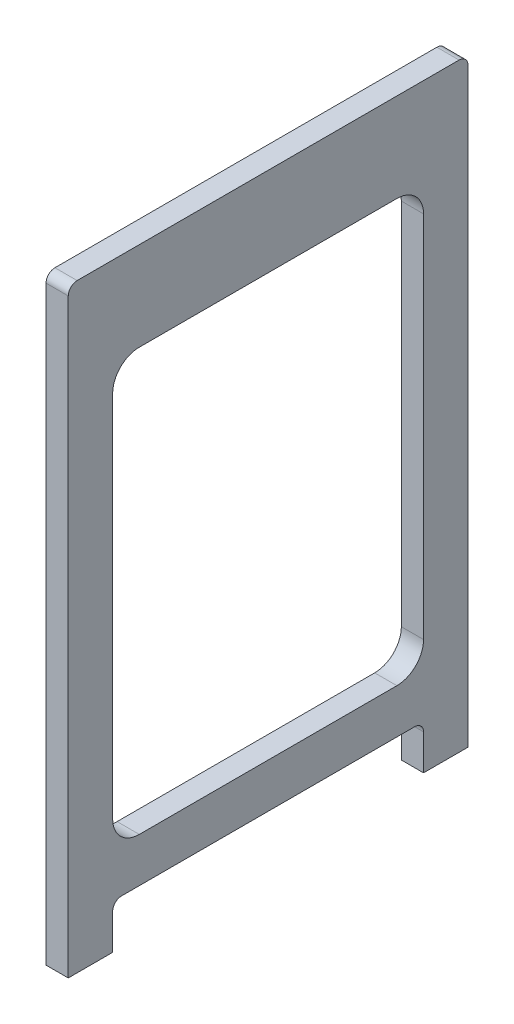
ISO-10303-21;
HEADER;
FILE_DESCRIPTION(('STEP AP214'),'2;1');
FILE_NAME('part.step','',(''),(''),'','','');
FILE_SCHEMA(('AUTOMOTIVE_DESIGN { 1 0 10303 214 1 1 1 1 }'));
ENDSEC;
DATA;
#1=APPLICATION_CONTEXT('core data for automotive mechanical design processes');
#2=APPLICATION_PROTOCOL_DEFINITION('international standard','automotive_design',2000,#1);
#3=PRODUCT_CONTEXT('',#1,'mechanical');
#4=PRODUCT('Part','Part','',(#3));
#5=PRODUCT_RELATED_PRODUCT_CATEGORY('part','',(#4));
#6=PRODUCT_DEFINITION_FORMATION('','',#4);
#7=PRODUCT_DEFINITION_CONTEXT('part definition',#1,'design');
#8=PRODUCT_DEFINITION('design','',#6,#7);
#9=PRODUCT_DEFINITION_SHAPE('','',#8);
#10=(LENGTH_UNIT() NAMED_UNIT(*) SI_UNIT(.MILLI.,.METRE.));
#11=(NAMED_UNIT(*) PLANE_ANGLE_UNIT() SI_UNIT($,.RADIAN.));
#12=(NAMED_UNIT(*) SI_UNIT($,.STERADIAN.) SOLID_ANGLE_UNIT());
#13=UNCERTAINTY_MEASURE_WITH_UNIT(LENGTH_MEASURE(1.E-05),#10,'distance_accuracy_value','');
#14=(GEOMETRIC_REPRESENTATION_CONTEXT(3) GLOBAL_UNCERTAINTY_ASSIGNED_CONTEXT((#13)) GLOBAL_UNIT_ASSIGNED_CONTEXT((#10,
#11,#12)) REPRESENTATION_CONTEXT('',''));
#15=CARTESIAN_POINT('',(0.,0.,0.));
#16=DIRECTION('',(0.,0.,1.));
#17=DIRECTION('',(1.,0.,0.));
#18=AXIS2_PLACEMENT_3D('',#15,#16,#17);
#19=CARTESIAN_POINT('',(12.5,330.,-110.));
#20=DIRECTION('',(-1.,0.,0.));
#21=DIRECTION('',(0.,0.,1.));
#22=AXIS2_PLACEMENT_3D('',#19,#20,#21);
#23=CYLINDRICAL_SURFACE('',#22,2.5);
#24=CARTESIAN_POINT('',(-12.5,330.,-110.));
#25=DIRECTION('',(1.,0.,0.));
#26=DIRECTION('',(0.,0.,1.));
#27=AXIS2_PLACEMENT_3D('',#24,#25,#26);
#28=CIRCLE('',#27,2.5);
#29=CARTESIAN_POINT('',(-12.5,330.,-107.5));
#30=VERTEX_POINT('',#29);
#31=EDGE_CURVE('E356',#30,#30,#28,.T.);
#32=ORIENTED_EDGE('',*,*,#31,.F.);
#33=EDGE_LOOP('',(#32));
#34=FACE_BOUND('',#33,.T.);
#35=CARTESIAN_POINT('',(-2.5,330.,-110.));
#36=DIRECTION('',(1.,0.,0.));
#37=DIRECTION('',(0.,0.,-1.));
#38=AXIS2_PLACEMENT_3D('',#35,#36,#37);
#39=CIRCLE('',#38,2.5);
#40=CARTESIAN_POINT('',(-2.5,330.,-112.5));
#41=VERTEX_POINT('',#40);
#42=EDGE_CURVE('E380',#41,#41,#39,.T.);
#43=ORIENTED_EDGE('',*,*,#42,.T.);
#44=EDGE_LOOP('',(#43));
#45=FACE_BOUND('',#44,.T.);
#46=ADVANCED_FACE('F34',(#34,#45),#23,.F.);
#47=CARTESIAN_POINT('',(12.5,315.,-130.));
#48=DIRECTION('',(-1.,0.,0.));
#49=DIRECTION('',(0.,0.,1.));
#50=AXIS2_PLACEMENT_3D('',#47,#48,#49);
#51=CYLINDRICAL_SURFACE('',#50,2.5);
#52=CARTESIAN_POINT('',(-12.5,315.,-130.));
#53=DIRECTION('',(1.,0.,0.));
#54=DIRECTION('',(0.,0.,1.));
#55=AXIS2_PLACEMENT_3D('',#52,#53,#54);
#56=CIRCLE('',#55,2.5);
#57=CARTESIAN_POINT('',(-12.5,315.,-127.5));
#58=VERTEX_POINT('',#57);
#59=EDGE_CURVE('E362',#58,#58,#56,.T.);
#60=ORIENTED_EDGE('',*,*,#59,.F.);
#61=EDGE_LOOP('',(#60));
#62=FACE_BOUND('',#61,.T.);
#63=CARTESIAN_POINT('',(-2.5,315.,-130.));
#64=DIRECTION('',(1.,0.,0.));
#65=DIRECTION('',(0.,0.,-1.));
#66=AXIS2_PLACEMENT_3D('',#63,#64,#65);
#67=CIRCLE('',#66,2.5);
#68=CARTESIAN_POINT('',(-2.5,315.,-132.5));
#69=VERTEX_POINT('',#68);
#70=EDGE_CURVE('E377',#69,#69,#67,.T.);
#71=ORIENTED_EDGE('',*,*,#70,.T.);
#72=EDGE_LOOP('',(#71));
#73=FACE_BOUND('',#72,.T.);
#74=ADVANCED_FACE('F401',(#62,#73),#51,.F.);
#75=CARTESIAN_POINT('',(12.5,330.,-150.));
#76=DIRECTION('',(-1.,0.,0.));
#77=DIRECTION('',(0.,0.,1.));
#78=AXIS2_PLACEMENT_3D('',#75,#76,#77);
#79=CYLINDRICAL_SURFACE('',#78,2.5);
#80=CARTESIAN_POINT('',(-12.5,330.,-150.));
#81=DIRECTION('',(1.,0.,0.));
#82=DIRECTION('',(0.,0.,1.));
#83=AXIS2_PLACEMENT_3D('',#80,#81,#82);
#84=CIRCLE('',#83,2.5);
#85=CARTESIAN_POINT('',(-12.5,330.,-147.5));
#86=VERTEX_POINT('',#85);
#87=EDGE_CURVE('E359',#86,#86,#84,.T.);
#88=ORIENTED_EDGE('',*,*,#87,.F.);
#89=EDGE_LOOP('',(#88));
#90=FACE_BOUND('',#89,.T.);
#91=CARTESIAN_POINT('',(-2.5,330.,-150.));
#92=DIRECTION('',(1.,0.,0.));
#93=DIRECTION('',(0.,0.,-1.));
#94=AXIS2_PLACEMENT_3D('',#91,#92,#93);
#95=CIRCLE('',#94,2.5);
#96=CARTESIAN_POINT('',(-2.5,330.,-152.5));
#97=VERTEX_POINT('',#96);
#98=EDGE_CURVE('E374',#97,#97,#95,.T.);
#99=ORIENTED_EDGE('',*,*,#98,.T.);
#100=EDGE_LOOP('',(#99));
#101=FACE_BOUND('',#100,.T.);
#102=ADVANCED_FACE('F407',(#90,#101),#79,.F.);
#103=CARTESIAN_POINT('',(12.5,330.,150.));
#104=DIRECTION('',(-1.,0.,0.));
#105=DIRECTION('',(0.,0.,1.));
#106=AXIS2_PLACEMENT_3D('',#103,#104,#105);
#107=CYLINDRICAL_SURFACE('',#106,2.5);
#108=CARTESIAN_POINT('',(-12.5,330.,150.));
#109=DIRECTION('',(1.,0.,0.));
#110=DIRECTION('',(0.,0.,-1.));
#111=AXIS2_PLACEMENT_3D('',#108,#109,#110);
#112=CIRCLE('',#111,2.5);
#113=CARTESIAN_POINT('',(-12.5,330.,147.5));
#114=VERTEX_POINT('',#113);
#115=EDGE_CURVE('E337',#114,#114,#112,.T.);
#116=ORIENTED_EDGE('',*,*,#115,.F.);
#117=EDGE_LOOP('',(#116));
#118=FACE_BOUND('',#117,.T.);
#119=CARTESIAN_POINT('',(-2.5,330.,150.));
#120=DIRECTION('',(1.,0.,0.));
#121=DIRECTION('',(0.,0.,-1.));
#122=AXIS2_PLACEMENT_3D('',#119,#120,#121);
#123=CIRCLE('',#122,2.5);
#124=CARTESIAN_POINT('',(-2.5,330.,147.5));
#125=VERTEX_POINT('',#124);
#126=EDGE_CURVE('E371',#125,#125,#123,.T.);
#127=ORIENTED_EDGE('',*,*,#126,.T.);
#128=EDGE_LOOP('',(#127));
#129=FACE_BOUND('',#128,.T.);
#130=ADVANCED_FACE('F417',(#118,#129),#107,.F.);
#131=CARTESIAN_POINT('',(12.5,315.,130.));
#132=DIRECTION('',(-1.,0.,0.));
#133=DIRECTION('',(0.,0.,1.));
#134=AXIS2_PLACEMENT_3D('',#131,#132,#133);
#135=CYLINDRICAL_SURFACE('',#134,2.5);
#136=CARTESIAN_POINT('',(-12.5,315.,130.));
#137=DIRECTION('',(1.,0.,0.));
#138=DIRECTION('',(0.,0.,-1.));
#139=AXIS2_PLACEMENT_3D('',#136,#137,#138);
#140=CIRCLE('',#139,2.5);
#141=CARTESIAN_POINT('',(-12.5,315.,127.5));
#142=VERTEX_POINT('',#141);
#143=EDGE_CURVE('E353',#142,#142,#140,.T.);
#144=ORIENTED_EDGE('',*,*,#143,.F.);
#145=EDGE_LOOP('',(#144));
#146=FACE_BOUND('',#145,.T.);
#147=CARTESIAN_POINT('',(-2.5,315.,130.));
#148=DIRECTION('',(1.,0.,0.));
#149=DIRECTION('',(0.,0.,-1.));
#150=AXIS2_PLACEMENT_3D('',#147,#148,#149);
#151=CIRCLE('',#150,2.5);
#152=CARTESIAN_POINT('',(-2.5,315.,127.5));
#153=VERTEX_POINT('',#152);
#154=EDGE_CURVE('E368',#153,#153,#151,.T.);
#155=ORIENTED_EDGE('',*,*,#154,.T.);
#156=EDGE_LOOP('',(#155));
#157=FACE_BOUND('',#156,.T.);
#158=ADVANCED_FACE('F413',(#146,#157),#135,.F.);
#159=CARTESIAN_POINT('',(12.5,330.,110.));
#160=DIRECTION('',(-1.,0.,0.));
#161=DIRECTION('',(0.,0.,1.));
#162=AXIS2_PLACEMENT_3D('',#159,#160,#161);
#163=CYLINDRICAL_SURFACE('',#162,2.5);
#164=CARTESIAN_POINT('',(-12.5,330.,110.));
#165=DIRECTION('',(1.,0.,0.));
#166=DIRECTION('',(0.,0.,-1.));
#167=AXIS2_PLACEMENT_3D('',#164,#165,#166);
#168=CIRCLE('',#167,2.5);
#169=CARTESIAN_POINT('',(-12.5,330.,107.5));
#170=VERTEX_POINT('',#169);
#171=EDGE_CURVE('E350',#170,#170,#168,.T.);
#172=ORIENTED_EDGE('',*,*,#171,.F.);
#173=EDGE_LOOP('',(#172));
#174=FACE_BOUND('',#173,.T.);
#175=CARTESIAN_POINT('',(-2.5,330.,110.));
#176=DIRECTION('',(1.,0.,0.));
#177=DIRECTION('',(0.,0.,-1.));
#178=AXIS2_PLACEMENT_3D('',#175,#176,#177);
#179=CIRCLE('',#178,2.5);
#180=CARTESIAN_POINT('',(-2.5,330.,107.5));
#181=VERTEX_POINT('',#180);
#182=EDGE_CURVE('E365',#181,#181,#179,.T.);
#183=ORIENTED_EDGE('',*,*,#182,.T.);
#184=EDGE_LOOP('',(#183));
#185=FACE_BOUND('',#184,.T.);
#186=ADVANCED_FACE('F416',(#174,#185),#163,.F.);
#187=CARTESIAN_POINT('',(12.5,0.,0.));
#188=DIRECTION('',(1.,0.,0.));
#189=DIRECTION('',(0.,0.,-1.));
#190=AXIS2_PLACEMENT_3D('',#187,#188,#189);
#191=PLANE('',#190);
#192=DIRECTION('',(0.,1.,0.));
#193=VECTOR('',#192,1.);
#194=CARTESIAN_POINT('',(12.5,-337.5,-225.));
#195=LINE('',#194,#193);
#196=CARTESIAN_POINT('',(12.5,-337.5,-225.));
#197=VERTEX_POINT('',#196);
#198=CARTESIAN_POINT('',(12.5,327.5,-225.));
#199=VERTEX_POINT('',#198);
#200=EDGE_CURVE('E268',#197,#199,#195,.T.);
#201=ORIENTED_EDGE('',*,*,#200,.T.);
#202=CARTESIAN_POINT('',(12.5,327.5,-215.));
#203=DIRECTION('',(1.,0.,0.));
#204=DIRECTION('',(0.,0.,-1.));
#205=AXIS2_PLACEMENT_3D('',#202,#203,#204);
#206=CIRCLE('',#205,10.);
#207=CARTESIAN_POINT('',(12.5,337.5,-215.));
#208=VERTEX_POINT('',#207);
#209=EDGE_CURVE('E42',#199,#208,#206,.T.);
#210=ORIENTED_EDGE('',*,*,#209,.T.);
#211=DIRECTION('',(0.,0.,1.));
#212=VECTOR('',#211,1.);
#213=CARTESIAN_POINT('',(12.5,337.5,-225.));
#214=LINE('',#213,#212);
#215=CARTESIAN_POINT('',(12.5,337.5,215.));
#216=VERTEX_POINT('',#215);
#217=EDGE_CURVE('E267',#208,#216,#214,.T.);
#218=ORIENTED_EDGE('',*,*,#217,.T.);
#219=CARTESIAN_POINT('',(12.5,327.5,215.));
#220=DIRECTION('',(1.,0.,0.));
#221=DIRECTION('',(0.,0.,-1.));
#222=AXIS2_PLACEMENT_3D('',#219,#220,#221);
#223=CIRCLE('',#222,10.);
#224=CARTESIAN_POINT('',(12.5,327.5,225.));
#225=VERTEX_POINT('',#224);
#226=EDGE_CURVE('E49',#216,#225,#223,.T.);
#227=ORIENTED_EDGE('',*,*,#226,.T.);
#228=DIRECTION('',(0.,-1.,0.));
#229=VECTOR('',#228,1.);
#230=CARTESIAN_POINT('',(12.5,-337.5,225.));
#231=LINE('',#230,#229);
#232=CARTESIAN_POINT('',(12.5,-337.5,225.));
#233=VERTEX_POINT('',#232);
#234=EDGE_CURVE('E171',#225,#233,#231,.T.);
#235=ORIENTED_EDGE('',*,*,#234,.T.);
#236=DIRECTION('',(0.,0.,-1.));
#237=VECTOR('',#236,1.);
#238=CARTESIAN_POINT('',(12.5,-337.5,175.));
#239=LINE('',#238,#237);
#240=CARTESIAN_POINT('',(12.5,-337.5,175.));
#241=VERTEX_POINT('',#240);
#242=EDGE_CURVE('E176',#233,#241,#239,.T.);
#243=ORIENTED_EDGE('',*,*,#242,.T.);
#244=DIRECTION('',(0.,1.,0.));
#245=VECTOR('',#244,1.);
#246=CARTESIAN_POINT('',(12.5,-337.5,175.));
#247=LINE('',#246,#245);
#248=CARTESIAN_POINT('',(12.5,-297.5,175.));
#249=VERTEX_POINT('',#248);
#250=EDGE_CURVE('E190',#241,#249,#247,.T.);
#251=ORIENTED_EDGE('',*,*,#250,.T.);
#252=CARTESIAN_POINT('',(12.5,-297.5,165.));
#253=DIRECTION('',(1.,0.,0.));
#254=DIRECTION('',(0.,0.,-1.));
#255=AXIS2_PLACEMENT_3D('',#252,#253,#254);
#256=CIRCLE('',#255,10.);
#257=CARTESIAN_POINT('',(12.5,-287.5,165.));
#258=VERTEX_POINT('',#257);
#259=EDGE_CURVE('E217',#249,#258,#256,.F.);
#260=ORIENTED_EDGE('',*,*,#259,.T.);
#261=DIRECTION('',(0.,0.,-1.));
#262=VECTOR('',#261,1.);
#263=CARTESIAN_POINT('',(12.5,-287.5,175.));
#264=LINE('',#263,#262);
#265=CARTESIAN_POINT('',(12.5,-287.5,-165.));
#266=VERTEX_POINT('',#265);
#267=EDGE_CURVE('E320',#258,#266,#264,.T.);
#268=ORIENTED_EDGE('',*,*,#267,.T.);
#269=CARTESIAN_POINT('',(12.5,-297.5,-165.));
#270=DIRECTION('',(1.,0.,0.));
#271=DIRECTION('',(0.,0.,-1.));
#272=AXIS2_PLACEMENT_3D('',#269,#270,#271);
#273=CIRCLE('',#272,10.);
#274=CARTESIAN_POINT('',(12.5,-297.5,-175.));
#275=VERTEX_POINT('',#274);
#276=EDGE_CURVE('E213',#266,#275,#273,.F.);
#277=ORIENTED_EDGE('',*,*,#276,.T.);
#278=DIRECTION('',(0.,-1.,0.));
#279=VECTOR('',#278,1.);
#280=CARTESIAN_POINT('',(12.5,-337.5,-175.));
#281=LINE('',#280,#279);
#282=CARTESIAN_POINT('',(12.5,-337.5,-175.));
#283=VERTEX_POINT('',#282);
#284=EDGE_CURVE('E318',#275,#283,#281,.T.);
#285=ORIENTED_EDGE('',*,*,#284,.T.);
#286=DIRECTION('',(0.,0.,-1.));
#287=VECTOR('',#286,1.);
#288=CARTESIAN_POINT('',(12.5,-337.5,-225.));
#289=LINE('',#288,#287);
#290=EDGE_CURVE('E300',#283,#197,#289,.T.);
#291=ORIENTED_EDGE('',*,*,#290,.T.);
#292=EDGE_LOOP('',(#201,#210,#218,#227,#235,#243,#251,#260,#268,#277,#285,#291));
#293=FACE_BOUND('',#292,.T.);
#294=DIRECTION('',(0.,0.,-1.));
#295=VECTOR('',#294,1.);
#296=CARTESIAN_POINT('',(12.5,-237.5,-175.));
#297=LINE('',#296,#295);
#298=CARTESIAN_POINT('',(12.5,-237.5,145.));
#299=VERTEX_POINT('',#298);
#300=CARTESIAN_POINT('',(12.5,-237.5,-145.));
#301=VERTEX_POINT('',#300);
#302=EDGE_CURVE('E343',#299,#301,#297,.T.);
#303=ORIENTED_EDGE('',*,*,#302,.F.);
#304=CARTESIAN_POINT('',(12.5,-207.5,145.));
#305=DIRECTION('',(1.,0.,0.));
#306=DIRECTION('',(0.,0.,-1.));
#307=AXIS2_PLACEMENT_3D('',#304,#305,#306);
#308=CIRCLE('',#307,30.);
#309=CARTESIAN_POINT('',(12.5,-207.5,175.));
#310=VERTEX_POINT('',#309);
#311=EDGE_CURVE('E253',#299,#310,#308,.F.);
#312=ORIENTED_EDGE('',*,*,#311,.T.);
#313=DIRECTION('',(0.,-1.,0.));
#314=VECTOR('',#313,1.);
#315=CARTESIAN_POINT('',(12.5,-237.5,175.));
#316=LINE('',#315,#314);
#317=CARTESIAN_POINT('',(12.5,207.5,175.));
#318=VERTEX_POINT('',#317);
#319=EDGE_CURVE('E327',#318,#310,#316,.T.);
#320=ORIENTED_EDGE('',*,*,#319,.F.);
#321=CARTESIAN_POINT('',(12.5,207.5,145.));
#322=DIRECTION('',(1.,0.,0.));
#323=DIRECTION('',(0.,0.,-1.));
#324=AXIS2_PLACEMENT_3D('',#321,#322,#323);
#325=CIRCLE('',#324,30.);
#326=CARTESIAN_POINT('',(12.5,237.5,145.));
#327=VERTEX_POINT('',#326);
#328=EDGE_CURVE('E241',#318,#327,#325,.F.);
#329=ORIENTED_EDGE('',*,*,#328,.T.);
#330=DIRECTION('',(0.,0.,1.));
#331=VECTOR('',#330,1.);
#332=CARTESIAN_POINT('',(12.5,237.5,-175.));
#333=LINE('',#332,#331);
#334=CARTESIAN_POINT('',(12.5,237.5,-145.));
#335=VERTEX_POINT('',#334);
#336=EDGE_CURVE('E314',#335,#327,#333,.T.);
#337=ORIENTED_EDGE('',*,*,#336,.F.);
#338=CARTESIAN_POINT('',(12.5,207.5,-145.));
#339=DIRECTION('',(1.,0.,0.));
#340=DIRECTION('',(0.,0.,-1.));
#341=AXIS2_PLACEMENT_3D('',#338,#339,#340);
#342=CIRCLE('',#341,30.);
#343=CARTESIAN_POINT('',(12.5,207.5,-175.));
#344=VERTEX_POINT('',#343);
#345=EDGE_CURVE('E245',#335,#344,#342,.F.);
#346=ORIENTED_EDGE('',*,*,#345,.T.);
#347=DIRECTION('',(0.,1.,0.));
#348=VECTOR('',#347,1.);
#349=CARTESIAN_POINT('',(12.5,-237.5,-175.));
#350=LINE('',#349,#348);
#351=CARTESIAN_POINT('',(12.5,-207.5,-175.));
#352=VERTEX_POINT('',#351);
#353=EDGE_CURVE('E340',#352,#344,#350,.T.);
#354=ORIENTED_EDGE('',*,*,#353,.F.);
#355=CARTESIAN_POINT('',(12.5,-207.5,-145.));
#356=DIRECTION('',(1.,0.,0.));
#357=DIRECTION('',(0.,0.,-1.));
#358=AXIS2_PLACEMENT_3D('',#355,#356,#357);
#359=CIRCLE('',#358,30.);
#360=EDGE_CURVE('E249',#352,#301,#359,.F.);
#361=ORIENTED_EDGE('',*,*,#360,.T.);
#362=EDGE_LOOP('',(#303,#312,#320,#329,#337,#346,#354,#361));
#363=FACE_BOUND('',#362,.T.);
#364=ADVANCED_FACE('F173',(#293,#363),#191,.T.);
#365=CARTESIAN_POINT('',(-12.5,0.,0.));
#366=DIRECTION('',(1.,0.,0.));
#367=DIRECTION('',(0.,0.,-1.));
#368=AXIS2_PLACEMENT_3D('',#365,#366,#367);
#369=PLANE('',#368);
#370=DIRECTION('',(0.,0.,1.));
#371=VECTOR('',#370,1.);
#372=CARTESIAN_POINT('',(-12.5,337.5,-225.));
#373=LINE('',#372,#371);
#374=CARTESIAN_POINT('',(-12.5,337.5,-215.));
#375=VERTEX_POINT('',#374);
#376=CARTESIAN_POINT('',(-12.5,337.5,215.));
#377=VERTEX_POINT('',#376);
#378=EDGE_CURVE('E181',#375,#377,#373,.T.);
#379=ORIENTED_EDGE('',*,*,#378,.F.);
#380=CARTESIAN_POINT('',(-12.5,327.5,-215.));
#381=DIRECTION('',(1.,0.,0.));
#382=DIRECTION('',(0.,0.,-1.));
#383=AXIS2_PLACEMENT_3D('',#380,#381,#382);
#384=CIRCLE('',#383,10.);
#385=CARTESIAN_POINT('',(-12.5,327.5,-225.));
#386=VERTEX_POINT('',#385);
#387=EDGE_CURVE('E262',#375,#386,#384,.F.);
#388=ORIENTED_EDGE('',*,*,#387,.T.);
#389=DIRECTION('',(0.,1.,0.));
#390=VECTOR('',#389,1.);
#391=CARTESIAN_POINT('',(-12.5,-337.5,-225.));
#392=LINE('',#391,#390);
#393=CARTESIAN_POINT('',(-12.5,-337.5,-225.));
#394=VERTEX_POINT('',#393);
#395=EDGE_CURVE('E284',#394,#386,#392,.T.);
#396=ORIENTED_EDGE('',*,*,#395,.F.);
#397=DIRECTION('',(0.,0.,-1.));
#398=VECTOR('',#397,1.);
#399=CARTESIAN_POINT('',(-12.5,-337.5,-225.));
#400=LINE('',#399,#398);
#401=CARTESIAN_POINT('',(-12.5,-337.5,-175.));
#402=VERTEX_POINT('',#401);
#403=EDGE_CURVE('E288',#402,#394,#400,.T.);
#404=ORIENTED_EDGE('',*,*,#403,.F.);
#405=DIRECTION('',(0.,-1.,0.));
#406=VECTOR('',#405,1.);
#407=CARTESIAN_POINT('',(-12.5,-337.5,-175.));
#408=LINE('',#407,#406);
#409=CARTESIAN_POINT('',(-12.5,-297.5,-175.));
#410=VERTEX_POINT('',#409);
#411=EDGE_CURVE('E291',#410,#402,#408,.T.);
#412=ORIENTED_EDGE('',*,*,#411,.F.);
#413=CARTESIAN_POINT('',(-12.5,-297.5,-165.));
#414=DIRECTION('',(1.,0.,0.));
#415=DIRECTION('',(0.,0.,-1.));
#416=AXIS2_PLACEMENT_3D('',#413,#414,#415);
#417=CIRCLE('',#416,10.);
#418=CARTESIAN_POINT('',(-12.5,-287.5,-165.));
#419=VERTEX_POINT('',#418);
#420=EDGE_CURVE('E211',#410,#419,#417,.T.);
#421=ORIENTED_EDGE('',*,*,#420,.T.);
#422=DIRECTION('',(0.,0.,-1.));
#423=VECTOR('',#422,1.);
#424=CARTESIAN_POINT('',(-12.5,-287.5,175.));
#425=LINE('',#424,#423);
#426=CARTESIAN_POINT('',(-12.5,-287.5,165.));
#427=VERTEX_POINT('',#426);
#428=EDGE_CURVE('E306',#427,#419,#425,.T.);
#429=ORIENTED_EDGE('',*,*,#428,.F.);
#430=CARTESIAN_POINT('',(-12.5,-297.5,165.));
#431=DIRECTION('',(1.,0.,0.));
#432=DIRECTION('',(0.,0.,-1.));
#433=AXIS2_PLACEMENT_3D('',#430,#431,#432);
#434=CIRCLE('',#433,10.);
#435=CARTESIAN_POINT('',(-12.5,-297.5,175.));
#436=VERTEX_POINT('',#435);
#437=EDGE_CURVE('E215',#427,#436,#434,.T.);
#438=ORIENTED_EDGE('',*,*,#437,.T.);
#439=DIRECTION('',(0.,1.,0.));
#440=VECTOR('',#439,1.);
#441=CARTESIAN_POINT('',(-12.5,-337.5,175.));
#442=LINE('',#441,#440);
#443=CARTESIAN_POINT('',(-12.5,-337.5,175.));
#444=VERTEX_POINT('',#443);
#445=EDGE_CURVE('E307',#444,#436,#442,.T.);
#446=ORIENTED_EDGE('',*,*,#445,.F.);
#447=DIRECTION('',(0.,0.,-1.));
#448=VECTOR('',#447,1.);
#449=CARTESIAN_POINT('',(-12.5,-337.5,175.));
#450=LINE('',#449,#448);
#451=CARTESIAN_POINT('',(-12.5,-337.5,225.));
#452=VERTEX_POINT('',#451);
#453=EDGE_CURVE('E312',#452,#444,#450,.T.);
#454=ORIENTED_EDGE('',*,*,#453,.F.);
#455=DIRECTION('',(0.,-1.,0.));
#456=VECTOR('',#455,1.);
#457=CARTESIAN_POINT('',(-12.5,-337.5,225.));
#458=LINE('',#457,#456);
#459=CARTESIAN_POINT('',(-12.5,327.5,225.));
#460=VERTEX_POINT('',#459);
#461=EDGE_CURVE('E194',#460,#452,#458,.T.);
#462=ORIENTED_EDGE('',*,*,#461,.F.);
#463=CARTESIAN_POINT('',(-12.5,327.5,215.));
#464=DIRECTION('',(1.,0.,0.));
#465=DIRECTION('',(0.,0.,-1.));
#466=AXIS2_PLACEMENT_3D('',#463,#464,#465);
#467=CIRCLE('',#466,10.);
#468=EDGE_CURVE('E260',#460,#377,#467,.F.);
#469=ORIENTED_EDGE('',*,*,#468,.T.);
#470=EDGE_LOOP('',(#379,#388,#396,#404,#412,#421,#429,#438,#446,#454,#462,#469));
#471=FACE_BOUND('',#470,.T.);
#472=DIRECTION('',(0.,0.,1.));
#473=VECTOR('',#472,1.);
#474=CARTESIAN_POINT('',(-12.5,237.5,-175.));
#475=LINE('',#474,#473);
#476=CARTESIAN_POINT('',(-12.5,237.5,-145.));
#477=VERTEX_POINT('',#476);
#478=CARTESIAN_POINT('',(-12.5,237.5,145.));
#479=VERTEX_POINT('',#478);
#480=EDGE_CURVE('E324',#477,#479,#475,.T.);
#481=ORIENTED_EDGE('',*,*,#480,.T.);
#482=CARTESIAN_POINT('',(-12.5,207.5,145.));
#483=DIRECTION('',(1.,0.,0.));
#484=DIRECTION('',(0.,0.,-1.));
#485=AXIS2_PLACEMENT_3D('',#482,#483,#484);
#486=CIRCLE('',#485,30.);
#487=CARTESIAN_POINT('',(-12.5,207.5,175.));
#488=VERTEX_POINT('',#487);
#489=EDGE_CURVE('E239',#479,#488,#486,.T.);
#490=ORIENTED_EDGE('',*,*,#489,.T.);
#491=DIRECTION('',(0.,-1.,0.));
#492=VECTOR('',#491,1.);
#493=CARTESIAN_POINT('',(-12.5,-237.5,175.));
#494=LINE('',#493,#492);
#495=CARTESIAN_POINT('',(-12.5,-207.5,175.));
#496=VERTEX_POINT('',#495);
#497=EDGE_CURVE('E334',#488,#496,#494,.T.);
#498=ORIENTED_EDGE('',*,*,#497,.T.);
#499=CARTESIAN_POINT('',(-12.5,-207.5,145.));
#500=DIRECTION('',(1.,0.,0.));
#501=DIRECTION('',(0.,0.,-1.));
#502=AXIS2_PLACEMENT_3D('',#499,#500,#501);
#503=CIRCLE('',#502,30.);
#504=CARTESIAN_POINT('',(-12.5,-237.5,145.));
#505=VERTEX_POINT('',#504);
#506=EDGE_CURVE('E251',#496,#505,#503,.T.);
#507=ORIENTED_EDGE('',*,*,#506,.T.);
#508=DIRECTION('',(0.,0.,-1.));
#509=VECTOR('',#508,1.);
#510=CARTESIAN_POINT('',(-12.5,-237.5,-175.));
#511=LINE('',#510,#509);
#512=CARTESIAN_POINT('',(-12.5,-237.5,-145.));
#513=VERTEX_POINT('',#512);
#514=EDGE_CURVE('E331',#505,#513,#511,.T.);
#515=ORIENTED_EDGE('',*,*,#514,.T.);
#516=CARTESIAN_POINT('',(-12.5,-207.5,-145.));
#517=DIRECTION('',(1.,0.,0.));
#518=DIRECTION('',(0.,0.,-1.));
#519=AXIS2_PLACEMENT_3D('',#516,#517,#518);
#520=CIRCLE('',#519,30.);
#521=CARTESIAN_POINT('',(-12.5,-207.5,-175.));
#522=VERTEX_POINT('',#521);
#523=EDGE_CURVE('E247',#513,#522,#520,.T.);
#524=ORIENTED_EDGE('',*,*,#523,.T.);
#525=DIRECTION('',(0.,1.,0.));
#526=VECTOR('',#525,1.);
#527=CARTESIAN_POINT('',(-12.5,-237.5,-175.));
#528=LINE('',#527,#526);
#529=CARTESIAN_POINT('',(-12.5,207.5,-175.));
#530=VERTEX_POINT('',#529);
#531=EDGE_CURVE('E328',#522,#530,#528,.T.);
#532=ORIENTED_EDGE('',*,*,#531,.T.);
#533=CARTESIAN_POINT('',(-12.5,207.5,-145.));
#534=DIRECTION('',(1.,0.,0.));
#535=DIRECTION('',(0.,0.,-1.));
#536=AXIS2_PLACEMENT_3D('',#533,#534,#535);
#537=CIRCLE('',#536,30.);
#538=EDGE_CURVE('E243',#530,#477,#537,.T.);
#539=ORIENTED_EDGE('',*,*,#538,.T.);
#540=EDGE_LOOP('',(#481,#490,#498,#507,#515,#524,#532,#539));
#541=FACE_BOUND('',#540,.T.);
#542=ORIENTED_EDGE('',*,*,#115,.T.);
#543=EDGE_LOOP('',(#542));
#544=FACE_BOUND('',#543,.T.);
#545=ORIENTED_EDGE('',*,*,#171,.T.);
#546=EDGE_LOOP('',(#545));
#547=FACE_BOUND('',#546,.T.);
#548=ORIENTED_EDGE('',*,*,#143,.T.);
#549=EDGE_LOOP('',(#548));
#550=FACE_BOUND('',#549,.T.);
#551=ORIENTED_EDGE('',*,*,#31,.T.);
#552=EDGE_LOOP('',(#551));
#553=FACE_BOUND('',#552,.T.);
#554=ORIENTED_EDGE('',*,*,#87,.T.);
#555=EDGE_LOOP('',(#554));
#556=FACE_BOUND('',#555,.T.);
#557=ORIENTED_EDGE('',*,*,#59,.T.);
#558=EDGE_LOOP('',(#557));
#559=FACE_BOUND('',#558,.T.);
#560=ADVANCED_FACE('F281',(#471,#541,#544,#547,#550,#553,#556,#559),#369,.F.);
#561=CARTESIAN_POINT('',(12.5,-337.5,225.));
#562=DIRECTION('',(0.,0.,-1.));
#563=DIRECTION('',(-1.,0.,0.));
#564=AXIS2_PLACEMENT_3D('',#561,#562,#563);
#565=PLANE('',#564);
#566=ORIENTED_EDGE('',*,*,#234,.F.);
#567=DIRECTION('',(-1.,0.,0.));
#568=VECTOR('',#567,1.);
#569=CARTESIAN_POINT('',(12.5,327.5,225.));
#570=LINE('',#569,#568);
#571=EDGE_CURVE('E11',#225,#460,#570,.T.);
#572=ORIENTED_EDGE('',*,*,#571,.T.);
#573=ORIENTED_EDGE('',*,*,#461,.T.);
#574=DIRECTION('',(-1.,0.,0.));
#575=VECTOR('',#574,1.);
#576=CARTESIAN_POINT('',(12.5,-337.5,225.));
#577=LINE('',#576,#575);
#578=EDGE_CURVE('E186',#233,#452,#577,.T.);
#579=ORIENTED_EDGE('',*,*,#578,.F.);
#580=EDGE_LOOP('',(#566,#572,#573,#579));
#581=FACE_BOUND('',#580,.T.);
#582=ADVANCED_FACE('F192',(#581),#565,.F.);
#583=CARTESIAN_POINT('',(12.5,-337.5,175.));
#584=DIRECTION('',(0.,1.,0.));
#585=DIRECTION('',(0.,0.,1.));
#586=AXIS2_PLACEMENT_3D('',#583,#584,#585);
#587=PLANE('',#586);
#588=ORIENTED_EDGE('',*,*,#453,.T.);
#589=DIRECTION('',(-1.,0.,0.));
#590=VECTOR('',#589,1.);
#591=CARTESIAN_POINT('',(12.5,-337.5,175.));
#592=LINE('',#591,#590);
#593=EDGE_CURVE('E188',#241,#444,#592,.T.);
#594=ORIENTED_EDGE('',*,*,#593,.F.);
#595=ORIENTED_EDGE('',*,*,#242,.F.);
#596=ORIENTED_EDGE('',*,*,#578,.T.);
#597=EDGE_LOOP('',(#588,#594,#595,#596));
#598=FACE_BOUND('',#597,.T.);
#599=ADVANCED_FACE('F185',(#598),#587,.F.);
#600=CARTESIAN_POINT('',(12.5,-337.5,175.));
#601=DIRECTION('',(0.,0.,1.));
#602=DIRECTION('',(1.,0.,0.));
#603=AXIS2_PLACEMENT_3D('',#600,#601,#602);
#604=PLANE('',#603);
#605=ORIENTED_EDGE('',*,*,#445,.T.);
#606=DIRECTION('',(-1.,0.,0.));
#607=VECTOR('',#606,1.);
#608=CARTESIAN_POINT('',(12.5,-297.5,175.));
#609=LINE('',#608,#607);
#610=EDGE_CURVE('E209',#436,#249,#609,.F.);
#611=ORIENTED_EDGE('',*,*,#610,.T.);
#612=ORIENTED_EDGE('',*,*,#250,.F.);
#613=ORIENTED_EDGE('',*,*,#593,.T.);
#614=EDGE_LOOP('',(#605,#611,#612,#613));
#615=FACE_BOUND('',#614,.T.);
#616=ADVANCED_FACE('F458',(#615),#604,.F.);
#617=CARTESIAN_POINT('',(12.5,-287.5,175.));
#618=DIRECTION('',(0.,1.,0.));
#619=DIRECTION('',(0.,0.,1.));
#620=AXIS2_PLACEMENT_3D('',#617,#618,#619);
#621=PLANE('',#620);
#622=ORIENTED_EDGE('',*,*,#428,.T.);
#623=DIRECTION('',(-1.,0.,0.));
#624=VECTOR('',#623,1.);
#625=CARTESIAN_POINT('',(12.5,-287.5,-165.));
#626=LINE('',#625,#624);
#627=EDGE_CURVE('E207',#419,#266,#626,.F.);
#628=ORIENTED_EDGE('',*,*,#627,.T.);
#629=ORIENTED_EDGE('',*,*,#267,.F.);
#630=DIRECTION('',(-1.,0.,0.));
#631=VECTOR('',#630,1.);
#632=CARTESIAN_POINT('',(-12.5,-287.5,165.));
#633=LINE('',#632,#631);
#634=EDGE_CURVE('E199',#258,#427,#633,.T.);
#635=ORIENTED_EDGE('',*,*,#634,.T.);
#636=EDGE_LOOP('',(#622,#628,#629,#635));
#637=FACE_BOUND('',#636,.T.);
#638=ADVANCED_FACE('F455',(#637),#621,.F.);
#639=CARTESIAN_POINT('',(12.5,-337.5,-175.));
#640=DIRECTION('',(0.,0.,-1.));
#641=DIRECTION('',(-1.,0.,0.));
#642=AXIS2_PLACEMENT_3D('',#639,#640,#641);
#643=PLANE('',#642);
#644=ORIENTED_EDGE('',*,*,#284,.F.);
#645=DIRECTION('',(-1.,0.,0.));
#646=VECTOR('',#645,1.);
#647=CARTESIAN_POINT('',(-12.5,-297.5,-175.));
#648=LINE('',#647,#646);
#649=EDGE_CURVE('E196',#275,#410,#648,.T.);
#650=ORIENTED_EDGE('',*,*,#649,.T.);
#651=ORIENTED_EDGE('',*,*,#411,.T.);
#652=DIRECTION('',(-1.,0.,0.));
#653=VECTOR('',#652,1.);
#654=CARTESIAN_POINT('',(12.5,-337.5,-175.));
#655=LINE('',#654,#653);
#656=EDGE_CURVE('E201',#283,#402,#655,.T.);
#657=ORIENTED_EDGE('',*,*,#656,.F.);
#658=EDGE_LOOP('',(#644,#650,#651,#657));
#659=FACE_BOUND('',#658,.T.);
#660=ADVANCED_FACE('F452',(#659),#643,.F.);
#661=CARTESIAN_POINT('',(12.5,-337.5,-225.));
#662=DIRECTION('',(0.,1.,0.));
#663=DIRECTION('',(0.,0.,1.));
#664=AXIS2_PLACEMENT_3D('',#661,#662,#663);
#665=PLANE('',#664);
#666=ORIENTED_EDGE('',*,*,#403,.T.);
#667=DIRECTION('',(-1.,0.,0.));
#668=VECTOR('',#667,1.);
#669=CARTESIAN_POINT('',(12.5,-337.5,-225.));
#670=LINE('',#669,#668);
#671=EDGE_CURVE('E276',#197,#394,#670,.T.);
#672=ORIENTED_EDGE('',*,*,#671,.F.);
#673=ORIENTED_EDGE('',*,*,#290,.F.);
#674=ORIENTED_EDGE('',*,*,#656,.T.);
#675=EDGE_LOOP('',(#666,#672,#673,#674));
#676=FACE_BOUND('',#675,.T.);
#677=ADVANCED_FACE('F299',(#676),#665,.F.);
#678=CARTESIAN_POINT('',(12.5,-337.5,-225.));
#679=DIRECTION('',(0.,0.,1.));
#680=DIRECTION('',(1.,0.,0.));
#681=AXIS2_PLACEMENT_3D('',#678,#679,#680);
#682=PLANE('',#681);
#683=ORIENTED_EDGE('',*,*,#395,.T.);
#684=DIRECTION('',(-1.,0.,0.));
#685=VECTOR('',#684,1.);
#686=CARTESIAN_POINT('',(12.5,327.5,-225.));
#687=LINE('',#686,#685);
#688=EDGE_CURVE('E57',#386,#199,#687,.F.);
#689=ORIENTED_EDGE('',*,*,#688,.T.);
#690=ORIENTED_EDGE('',*,*,#200,.F.);
#691=ORIENTED_EDGE('',*,*,#671,.T.);
#692=EDGE_LOOP('',(#683,#689,#690,#691));
#693=FACE_BOUND('',#692,.T.);
#694=ADVANCED_FACE('F286',(#693),#682,.F.);
#695=CARTESIAN_POINT('',(12.5,337.5,-225.));
#696=DIRECTION('',(0.,-1.,0.));
#697=DIRECTION('',(0.,0.,-1.));
#698=AXIS2_PLACEMENT_3D('',#695,#696,#697);
#699=PLANE('',#698);
#700=ORIENTED_EDGE('',*,*,#217,.F.);
#701=DIRECTION('',(-1.,0.,0.));
#702=VECTOR('',#701,1.);
#703=CARTESIAN_POINT('',(12.5,337.5,-215.));
#704=LINE('',#703,#702);
#705=EDGE_CURVE('E257',#208,#375,#704,.T.);
#706=ORIENTED_EDGE('',*,*,#705,.T.);
#707=ORIENTED_EDGE('',*,*,#378,.T.);
#708=DIRECTION('',(-1.,0.,0.));
#709=VECTOR('',#708,1.);
#710=CARTESIAN_POINT('',(12.5,337.5,215.));
#711=LINE('',#710,#709);
#712=EDGE_CURVE('E255',#377,#216,#711,.F.);
#713=ORIENTED_EDGE('',*,*,#712,.T.);
#714=EDGE_LOOP('',(#700,#706,#707,#713));
#715=FACE_BOUND('',#714,.T.);
#716=ADVANCED_FACE('F272',(#715),#699,.F.);
#717=CARTESIAN_POINT('',(12.5,-237.5,175.));
#718=DIRECTION('',(0.,0.,-1.));
#719=DIRECTION('',(-1.,0.,0.));
#720=AXIS2_PLACEMENT_3D('',#717,#718,#719);
#721=PLANE('',#720);
#722=ORIENTED_EDGE('',*,*,#497,.F.);
#723=DIRECTION('',(-1.,0.,0.));
#724=VECTOR('',#723,1.);
#725=CARTESIAN_POINT('',(12.5,207.5,175.));
#726=LINE('',#725,#724);
#727=EDGE_CURVE('E227',#488,#318,#726,.F.);
#728=ORIENTED_EDGE('',*,*,#727,.T.);
#729=ORIENTED_EDGE('',*,*,#319,.T.);
#730=DIRECTION('',(-1.,0.,0.));
#731=VECTOR('',#730,1.);
#732=CARTESIAN_POINT('',(-12.5,-207.5,175.));
#733=LINE('',#732,#731);
#734=EDGE_CURVE('E224',#310,#496,#733,.T.);
#735=ORIENTED_EDGE('',*,*,#734,.T.);
#736=EDGE_LOOP('',(#722,#728,#729,#735));
#737=FACE_BOUND('',#736,.T.);
#738=ADVANCED_FACE('F437',(#737),#721,.T.);
#739=CARTESIAN_POINT('',(12.5,-237.5,-175.));
#740=DIRECTION('',(0.,1.,0.));
#741=DIRECTION('',(0.,0.,1.));
#742=AXIS2_PLACEMENT_3D('',#739,#740,#741);
#743=PLANE('',#742);
#744=ORIENTED_EDGE('',*,*,#302,.T.);
#745=DIRECTION('',(-1.,0.,0.));
#746=VECTOR('',#745,1.);
#747=CARTESIAN_POINT('',(-12.5,-237.5,-145.));
#748=LINE('',#747,#746);
#749=EDGE_CURVE('E236',#301,#513,#748,.T.);
#750=ORIENTED_EDGE('',*,*,#749,.T.);
#751=ORIENTED_EDGE('',*,*,#514,.F.);
#752=DIRECTION('',(-1.,0.,0.));
#753=VECTOR('',#752,1.);
#754=CARTESIAN_POINT('',(12.5,-237.5,145.));
#755=LINE('',#754,#753);
#756=EDGE_CURVE('E234',#505,#299,#755,.F.);
#757=ORIENTED_EDGE('',*,*,#756,.T.);
#758=EDGE_LOOP('',(#744,#750,#751,#757));
#759=FACE_BOUND('',#758,.T.);
#760=ADVANCED_FACE('F433',(#759),#743,.T.);
#761=CARTESIAN_POINT('',(12.5,-237.5,-175.));
#762=DIRECTION('',(0.,0.,1.));
#763=DIRECTION('',(1.,0.,0.));
#764=AXIS2_PLACEMENT_3D('',#761,#762,#763);
#765=PLANE('',#764);
#766=ORIENTED_EDGE('',*,*,#353,.T.);
#767=DIRECTION('',(-1.,0.,0.));
#768=VECTOR('',#767,1.);
#769=CARTESIAN_POINT('',(-12.5,207.5,-175.));
#770=LINE('',#769,#768);
#771=EDGE_CURVE('E231',#344,#530,#770,.T.);
#772=ORIENTED_EDGE('',*,*,#771,.T.);
#773=ORIENTED_EDGE('',*,*,#531,.F.);
#774=DIRECTION('',(-1.,0.,0.));
#775=VECTOR('',#774,1.);
#776=CARTESIAN_POINT('',(12.5,-207.5,-175.));
#777=LINE('',#776,#775);
#778=EDGE_CURVE('E229',#522,#352,#777,.F.);
#779=ORIENTED_EDGE('',*,*,#778,.T.);
#780=EDGE_LOOP('',(#766,#772,#773,#779));
#781=FACE_BOUND('',#780,.T.);
#782=ADVANCED_FACE('F429',(#781),#765,.T.);
#783=CARTESIAN_POINT('',(12.5,237.5,-175.));
#784=DIRECTION('',(0.,-1.,0.));
#785=DIRECTION('',(0.,0.,-1.));
#786=AXIS2_PLACEMENT_3D('',#783,#784,#785);
#787=PLANE('',#786);
#788=ORIENTED_EDGE('',*,*,#336,.T.);
#789=DIRECTION('',(-1.,0.,0.));
#790=VECTOR('',#789,1.);
#791=CARTESIAN_POINT('',(-12.5,237.5,145.));
#792=LINE('',#791,#790);
#793=EDGE_CURVE('E221',#327,#479,#792,.T.);
#794=ORIENTED_EDGE('',*,*,#793,.T.);
#795=ORIENTED_EDGE('',*,*,#480,.F.);
#796=DIRECTION('',(-1.,0.,0.));
#797=VECTOR('',#796,1.);
#798=CARTESIAN_POINT('',(12.5,237.5,-145.));
#799=LINE('',#798,#797);
#800=EDGE_CURVE('E219',#477,#335,#799,.F.);
#801=ORIENTED_EDGE('',*,*,#800,.T.);
#802=EDGE_LOOP('',(#788,#794,#795,#801));
#803=FACE_BOUND('',#802,.T.);
#804=ADVANCED_FACE('F425',(#803),#787,.T.);
#805=CARTESIAN_POINT('',(-2.5,330.,110.));
#806=DIRECTION('',(1.,0.,0.));
#807=DIRECTION('',(0.,0.,-1.));
#808=AXIS2_PLACEMENT_3D('',#805,#806,#807);
#809=PLANE('',#808);
#810=ORIENTED_EDGE('',*,*,#182,.F.);
#811=EDGE_LOOP('',(#810));
#812=FACE_BOUND('',#811,.T.);
#813=ADVANCED_FACE('F428',(#812),#809,.F.);
#814=CARTESIAN_POINT('',(-2.5,315.,130.));
#815=DIRECTION('',(1.,0.,0.));
#816=DIRECTION('',(0.,0.,-1.));
#817=AXIS2_PLACEMENT_3D('',#814,#815,#816);
#818=PLANE('',#817);
#819=ORIENTED_EDGE('',*,*,#154,.F.);
#820=EDGE_LOOP('',(#819));
#821=FACE_BOUND('',#820,.T.);
#822=ADVANCED_FACE('F648',(#821),#818,.F.);
#823=CARTESIAN_POINT('',(-2.5,330.,150.));
#824=DIRECTION('',(1.,0.,0.));
#825=DIRECTION('',(0.,0.,-1.));
#826=AXIS2_PLACEMENT_3D('',#823,#824,#825);
#827=PLANE('',#826);
#828=ORIENTED_EDGE('',*,*,#126,.F.);
#829=EDGE_LOOP('',(#828));
#830=FACE_BOUND('',#829,.T.);
#831=ADVANCED_FACE('F638',(#830),#827,.F.);
#832=CARTESIAN_POINT('',(-2.5,330.,-150.));
#833=DIRECTION('',(1.,0.,0.));
#834=DIRECTION('',(0.,0.,-1.));
#835=AXIS2_PLACEMENT_3D('',#832,#833,#834);
#836=PLANE('',#835);
#837=ORIENTED_EDGE('',*,*,#98,.F.);
#838=EDGE_LOOP('',(#837));
#839=FACE_BOUND('',#838,.T.);
#840=ADVANCED_FACE('F397',(#839),#836,.F.);
#841=CARTESIAN_POINT('',(-2.5,315.,-130.));
#842=DIRECTION('',(1.,0.,0.));
#843=DIRECTION('',(0.,0.,-1.));
#844=AXIS2_PLACEMENT_3D('',#841,#842,#843);
#845=PLANE('',#844);
#846=ORIENTED_EDGE('',*,*,#70,.F.);
#847=EDGE_LOOP('',(#846));
#848=FACE_BOUND('',#847,.T.);
#849=ADVANCED_FACE('F388',(#848),#845,.F.);
#850=CARTESIAN_POINT('',(-2.5,330.,-110.));
#851=DIRECTION('',(1.,0.,0.));
#852=DIRECTION('',(0.,0.,-1.));
#853=AXIS2_PLACEMENT_3D('',#850,#851,#852);
#854=PLANE('',#853);
#855=ORIENTED_EDGE('',*,*,#42,.F.);
#856=EDGE_LOOP('',(#855));
#857=FACE_BOUND('',#856,.T.);
#858=ADVANCED_FACE('F385',(#857),#854,.F.);
#859=CARTESIAN_POINT('',(12.5,-297.5,-165.));
#860=DIRECTION('',(1.,0.,0.));
#861=DIRECTION('',(0.,0.,-1.));
#862=AXIS2_PLACEMENT_3D('',#859,#860,#861);
#863=CYLINDRICAL_SURFACE('',#862,10.);
#864=ORIENTED_EDGE('',*,*,#276,.F.);
#865=ORIENTED_EDGE('',*,*,#627,.F.);
#866=ORIENTED_EDGE('',*,*,#420,.F.);
#867=ORIENTED_EDGE('',*,*,#649,.F.);
#868=EDGE_LOOP('',(#864,#865,#866,#867));
#869=FACE_BOUND('',#868,.T.);
#870=ADVANCED_FACE('F387',(#869),#863,.F.);
#871=CARTESIAN_POINT('',(12.5,-297.5,165.));
#872=DIRECTION('',(1.,0.,0.));
#873=DIRECTION('',(0.,0.,-1.));
#874=AXIS2_PLACEMENT_3D('',#871,#872,#873);
#875=CYLINDRICAL_SURFACE('',#874,10.);
#876=ORIENTED_EDGE('',*,*,#259,.F.);
#877=ORIENTED_EDGE('',*,*,#610,.F.);
#878=ORIENTED_EDGE('',*,*,#437,.F.);
#879=ORIENTED_EDGE('',*,*,#634,.F.);
#880=EDGE_LOOP('',(#876,#877,#878,#879));
#881=FACE_BOUND('',#880,.T.);
#882=ADVANCED_FACE('F394',(#881),#875,.F.);
#883=CARTESIAN_POINT('',(12.5,207.5,145.));
#884=DIRECTION('',(1.,0.,0.));
#885=DIRECTION('',(0.,0.,-1.));
#886=AXIS2_PLACEMENT_3D('',#883,#884,#885);
#887=CYLINDRICAL_SURFACE('',#886,30.);
#888=ORIENTED_EDGE('',*,*,#328,.F.);
#889=ORIENTED_EDGE('',*,*,#727,.F.);
#890=ORIENTED_EDGE('',*,*,#489,.F.);
#891=ORIENTED_EDGE('',*,*,#793,.F.);
#892=EDGE_LOOP('',(#888,#889,#890,#891));
#893=FACE_BOUND('',#892,.T.);
#894=ADVANCED_FACE('F469',(#893),#887,.F.);
#895=CARTESIAN_POINT('',(12.5,207.5,-145.));
#896=DIRECTION('',(1.,0.,0.));
#897=DIRECTION('',(0.,0.,-1.));
#898=AXIS2_PLACEMENT_3D('',#895,#896,#897);
#899=CYLINDRICAL_SURFACE('',#898,30.);
#900=ORIENTED_EDGE('',*,*,#345,.F.);
#901=ORIENTED_EDGE('',*,*,#800,.F.);
#902=ORIENTED_EDGE('',*,*,#538,.F.);
#903=ORIENTED_EDGE('',*,*,#771,.F.);
#904=EDGE_LOOP('',(#900,#901,#902,#903));
#905=FACE_BOUND('',#904,.T.);
#906=ADVANCED_FACE('F473',(#905),#899,.F.);
#907=CARTESIAN_POINT('',(12.5,-207.5,-145.));
#908=DIRECTION('',(1.,0.,0.));
#909=DIRECTION('',(0.,0.,-1.));
#910=AXIS2_PLACEMENT_3D('',#907,#908,#909);
#911=CYLINDRICAL_SURFACE('',#910,30.);
#912=ORIENTED_EDGE('',*,*,#360,.F.);
#913=ORIENTED_EDGE('',*,*,#778,.F.);
#914=ORIENTED_EDGE('',*,*,#523,.F.);
#915=ORIENTED_EDGE('',*,*,#749,.F.);
#916=EDGE_LOOP('',(#912,#913,#914,#915));
#917=FACE_BOUND('',#916,.T.);
#918=ADVANCED_FACE('F477',(#917),#911,.F.);
#919=CARTESIAN_POINT('',(12.5,-207.5,145.));
#920=DIRECTION('',(1.,0.,0.));
#921=DIRECTION('',(0.,0.,-1.));
#922=AXIS2_PLACEMENT_3D('',#919,#920,#921);
#923=CYLINDRICAL_SURFACE('',#922,30.);
#924=ORIENTED_EDGE('',*,*,#311,.F.);
#925=ORIENTED_EDGE('',*,*,#756,.F.);
#926=ORIENTED_EDGE('',*,*,#506,.F.);
#927=ORIENTED_EDGE('',*,*,#734,.F.);
#928=EDGE_LOOP('',(#924,#925,#926,#927));
#929=FACE_BOUND('',#928,.T.);
#930=ADVANCED_FACE('F481',(#929),#923,.F.);
#931=CARTESIAN_POINT('',(12.5,327.5,-215.));
#932=DIRECTION('',(-1.,0.,0.));
#933=DIRECTION('',(0.,0.,1.));
#934=AXIS2_PLACEMENT_3D('',#931,#932,#933);
#935=CYLINDRICAL_SURFACE('',#934,10.);
#936=ORIENTED_EDGE('',*,*,#209,.F.);
#937=ORIENTED_EDGE('',*,*,#688,.F.);
#938=ORIENTED_EDGE('',*,*,#387,.F.);
#939=ORIENTED_EDGE('',*,*,#705,.F.);
#940=EDGE_LOOP('',(#936,#937,#938,#939));
#941=FACE_BOUND('',#940,.T.);
#942=ADVANCED_FACE('F278',(#941),#935,.T.);
#943=CARTESIAN_POINT('',(12.5,327.5,215.));
#944=DIRECTION('',(-1.,0.,0.));
#945=DIRECTION('',(0.,0.,1.));
#946=AXIS2_PLACEMENT_3D('',#943,#944,#945);
#947=CYLINDRICAL_SURFACE('',#946,10.);
#948=ORIENTED_EDGE('',*,*,#226,.F.);
#949=ORIENTED_EDGE('',*,*,#712,.F.);
#950=ORIENTED_EDGE('',*,*,#468,.F.);
#951=ORIENTED_EDGE('',*,*,#571,.F.);
#952=EDGE_LOOP('',(#948,#949,#950,#951));
#953=FACE_BOUND('',#952,.T.);
#954=ADVANCED_FACE('F36',(#953),#947,.T.);
#955=CLOSED_SHELL('',(#46,#74,#102,#130,#158,#186,#364,#560,#582,#599,#616,#638,#660,#677,#694,
#716,#738,#760,#782,#804,#813,#822,#831,#840,#849,#858,#870,#882,#894,#906,#918,#930,#942,#954));
#956=MANIFOLD_SOLID_BREP('B2',#955);
#957=ADVANCED_BREP_SHAPE_REPRESENTATION('',(#18,#956),#14);
#958=SHAPE_DEFINITION_REPRESENTATION(#9,#957);
ENDSEC;
END-ISO-10303-21;
